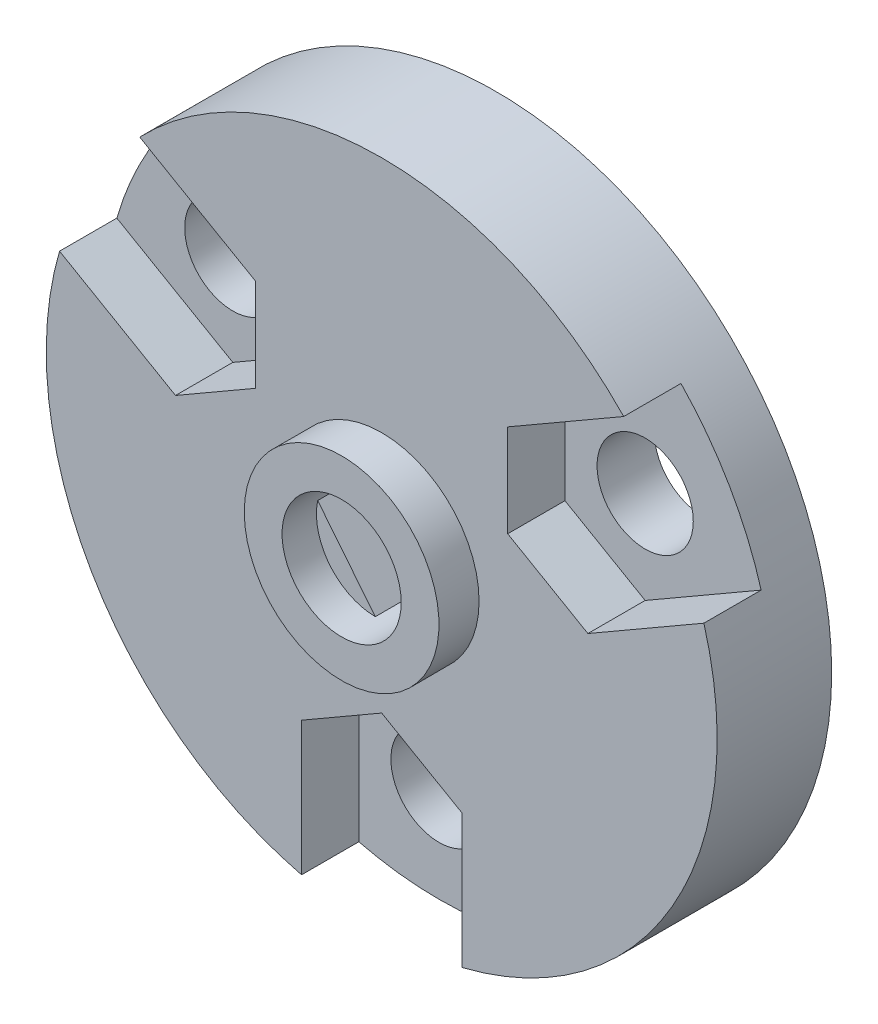
ISO-10303-21;
HEADER;
FILE_DESCRIPTION(('STEP AP214'),'2;1');
FILE_NAME('part.step','',(''),(''),'','','');
FILE_SCHEMA(('AUTOMOTIVE_DESIGN { 1 0 10303 214 1 1 1 1 }'));
ENDSEC;
DATA;
#1=APPLICATION_CONTEXT('core data for automotive mechanical design processes');
#2=APPLICATION_PROTOCOL_DEFINITION('international standard','automotive_design',2000,#1);
#3=PRODUCT_CONTEXT('',#1,'mechanical');
#4=PRODUCT('Part','Part','',(#3));
#5=PRODUCT_RELATED_PRODUCT_CATEGORY('part','',(#4));
#6=PRODUCT_DEFINITION_FORMATION('','',#4);
#7=PRODUCT_DEFINITION_CONTEXT('part definition',#1,'design');
#8=PRODUCT_DEFINITION('design','',#6,#7);
#9=PRODUCT_DEFINITION_SHAPE('','',#8);
#10=(LENGTH_UNIT() NAMED_UNIT(*) SI_UNIT(.MILLI.,.METRE.));
#11=(NAMED_UNIT(*) PLANE_ANGLE_UNIT() SI_UNIT($,.RADIAN.));
#12=(NAMED_UNIT(*) SI_UNIT($,.STERADIAN.) SOLID_ANGLE_UNIT());
#13=UNCERTAINTY_MEASURE_WITH_UNIT(LENGTH_MEASURE(1.E-05),#10,'distance_accuracy_value','');
#14=(GEOMETRIC_REPRESENTATION_CONTEXT(3) GLOBAL_UNCERTAINTY_ASSIGNED_CONTEXT((#13)) GLOBAL_UNIT_ASSIGNED_CONTEXT((#10,
#11,#12)) REPRESENTATION_CONTEXT('',''));
#15=CARTESIAN_POINT('',(0.,0.,0.));
#16=DIRECTION('',(0.,0.,1.));
#17=DIRECTION('',(1.,0.,0.));
#18=AXIS2_PLACEMENT_3D('',#15,#16,#17);
#19=CARTESIAN_POINT('',(0.,0.,5.24999999999999));
#20=DIRECTION('',(0.,0.,1.));
#21=DIRECTION('',(1.,0.,0.));
#22=AXIS2_PLACEMENT_3D('',#19,#20,#21);
#23=PLANE('',#22);
#24=DIRECTION('',(0.625469901980904,-0.780248294913868,0.));
#25=VECTOR('',#24,1.);
#26=CARTESIAN_POINT('',(-1.28740968660788,-1.03202533826849,5.24999999999999));
#27=LINE('',#26,#25);
#28=CARTESIAN_POINT('',(-2.54419959171201,0.535769015091784,5.24999999999999));
#29=VERTEX_POINT('',#28);
#30=CARTESIAN_POINT('',(-0.0306197815037451,-2.59981969162876,5.24999999999999));
#31=VERTEX_POINT('',#30);
#32=EDGE_CURVE('E12',#29,#31,#27,.T.);
#33=ORIENTED_EDGE('',*,*,#32,.F.);
#34=CARTESIAN_POINT('',(0.,0.,5.24999999999999));
#35=DIRECTION('',(0.,0.,1.));
#36=DIRECTION('',(1.,0.,0.));
#37=AXIS2_PLACEMENT_3D('',#34,#35,#36);
#38=CIRCLE('',#37,2.6);
#39=EDGE_CURVE('E198',#29,#31,#38,.T.);
#40=ORIENTED_EDGE('',*,*,#39,.T.);
#41=EDGE_LOOP('',(#33,#40));
#42=FACE_BOUND('',#41,.T.);
#43=ADVANCED_FACE('F38',(#42),#23,.T.);
#44=CARTESIAN_POINT('',(0.,0.,5.));
#45=DIRECTION('',(0.,0.,1.));
#46=DIRECTION('',(1.,0.,0.));
#47=AXIS2_PLACEMENT_3D('',#44,#45,#46);
#48=PLANE('',#47);
#49=DIRECTION('',(0.,1.,0.));
#50=VECTOR('',#49,1.);
#51=CARTESIAN_POINT('',(-3.5,-8.37157890324957,5.));
#52=LINE('',#51,#50);
#53=CARTESIAN_POINT('',(-3.5,-14.2178441117496,5.));
#54=VERTEX_POINT('',#53);
#55=CARTESIAN_POINT('',(-3.5,-8.37157890324957,5.));
#56=VERTEX_POINT('',#55);
#57=EDGE_CURVE('E226',#54,#56,#52,.T.);
#58=ORIENTED_EDGE('',*,*,#57,.T.);
#59=DIRECTION('',(0.866025403784439,0.499999999999999,0.));
#60=VECTOR('',#59,1.);
#61=CARTESIAN_POINT('',(0.,-6.35085296108588,5.));
#62=LINE('',#61,#60);
#63=CARTESIAN_POINT('',(0.,-6.35085296108588,5.));
#64=VERTEX_POINT('',#63);
#65=EDGE_CURVE('E229',#56,#64,#62,.T.);
#66=ORIENTED_EDGE('',*,*,#65,.T.);
#67=DIRECTION('',(0.866025403784438,-0.500000000000001,0.));
#68=VECTOR('',#67,1.);
#69=CARTESIAN_POINT('',(3.5,-8.37157890324958,5.));
#70=LINE('',#69,#68);
#71=CARTESIAN_POINT('',(3.5,-8.37157890324958,5.));
#72=VERTEX_POINT('',#71);
#73=EDGE_CURVE('E232',#64,#72,#70,.T.);
#74=ORIENTED_EDGE('',*,*,#73,.T.);
#75=DIRECTION('',(0.,-1.,0.));
#76=VECTOR('',#75,1.);
#77=CARTESIAN_POINT('',(3.5,-8.37157890324958,5.));
#78=LINE('',#77,#76);
#79=CARTESIAN_POINT('',(3.5,-14.2178441117496,5.));
#80=VERTEX_POINT('',#79);
#81=EDGE_CURVE('E234',#72,#80,#78,.T.);
#82=ORIENTED_EDGE('',*,*,#81,.T.);
#83=CARTESIAN_POINT('',(0.,0.,5.));
#84=DIRECTION('',(0.,0.,1.));
#85=DIRECTION('',(1.,0.,0.));
#86=AXIS2_PLACEMENT_3D('',#83,#84,#85);
#87=CIRCLE('',#86,14.6423048454133);
#88=CARTESIAN_POINT('',(14.0630141878222,4.07783314262928,5.));
#89=VERTEX_POINT('',#88);
#90=EDGE_CURVE('E236',#80,#89,#87,.T.);
#91=ORIENTED_EDGE('',*,*,#90,.T.);
#92=DIRECTION('',(-0.866025403784439,-0.5,0.));
#93=VECTOR('',#92,1.);
#94=CARTESIAN_POINT('',(8.99999999999999,1.15470053837925,5.));
#95=LINE('',#94,#93);
#96=CARTESIAN_POINT('',(8.99999999999999,1.15470053837925,5.));
#97=VERTEX_POINT('',#96);
#98=EDGE_CURVE('E238',#89,#97,#95,.T.);
#99=ORIENTED_EDGE('',*,*,#98,.T.);
#100=DIRECTION('',(-0.866025403784438,0.500000000000001,0.));
#101=VECTOR('',#100,1.);
#102=CARTESIAN_POINT('',(5.5,3.17542648054294,5.));
#103=LINE('',#102,#101);
#104=CARTESIAN_POINT('',(5.5,3.17542648054294,5.));
#105=VERTEX_POINT('',#104);
#106=EDGE_CURVE('E240',#97,#105,#103,.T.);
#107=ORIENTED_EDGE('',*,*,#106,.T.);
#108=DIRECTION('',(0.,1.,0.));
#109=VECTOR('',#108,1.);
#110=CARTESIAN_POINT('',(5.5,7.21687836487032,5.));
#111=LINE('',#110,#109);
#112=CARTESIAN_POINT('',(5.5,7.21687836487032,5.));
#113=VERTEX_POINT('',#112);
#114=EDGE_CURVE('E242',#105,#113,#111,.T.);
#115=ORIENTED_EDGE('',*,*,#114,.T.);
#116=DIRECTION('',(0.866025403784438,0.5,0.));
#117=VECTOR('',#116,1.);
#118=CARTESIAN_POINT('',(5.5,7.21687836487032,5.));
#119=LINE('',#118,#117);
#120=CARTESIAN_POINT('',(10.5630141878222,10.1400109691203,5.));
#121=VERTEX_POINT('',#120);
#122=EDGE_CURVE('E244',#113,#121,#119,.T.);
#123=ORIENTED_EDGE('',*,*,#122,.T.);
#124=CARTESIAN_POINT('',(0.,0.,5.));
#125=DIRECTION('',(0.,0.,1.));
#126=DIRECTION('',(1.,0.,0.));
#127=AXIS2_PLACEMENT_3D('',#124,#125,#126);
#128=CIRCLE('',#127,14.6423048454133);
#129=CARTESIAN_POINT('',(-10.5630141878222,10.1400109691203,5.));
#130=VERTEX_POINT('',#129);
#131=EDGE_CURVE('E246',#121,#130,#128,.T.);
#132=ORIENTED_EDGE('',*,*,#131,.T.);
#133=DIRECTION('',(0.866025403784439,-0.5,0.));
#134=VECTOR('',#133,1.);
#135=CARTESIAN_POINT('',(-5.5,7.21687836487031,5.));
#136=LINE('',#135,#134);
#137=CARTESIAN_POINT('',(-5.5,7.21687836487031,5.));
#138=VERTEX_POINT('',#137);
#139=EDGE_CURVE('E248',#130,#138,#136,.T.);
#140=ORIENTED_EDGE('',*,*,#139,.T.);
#141=DIRECTION('',(0.,-1.,0.));
#142=VECTOR('',#141,1.);
#143=CARTESIAN_POINT('',(-5.5,3.17542648054294,5.));
#144=LINE('',#143,#142);
#145=CARTESIAN_POINT('',(-5.5,3.17542648054294,5.));
#146=VERTEX_POINT('',#145);
#147=EDGE_CURVE('E250',#138,#146,#144,.T.);
#148=ORIENTED_EDGE('',*,*,#147,.T.);
#149=DIRECTION('',(-0.866025403784439,-0.499999999999999,0.));
#150=VECTOR('',#149,1.);
#151=CARTESIAN_POINT('',(-9.,1.15470053837925,5.));
#152=LINE('',#151,#150);
#153=CARTESIAN_POINT('',(-9.,1.15470053837925,5.));
#154=VERTEX_POINT('',#153);
#155=EDGE_CURVE('E252',#146,#154,#152,.T.);
#156=ORIENTED_EDGE('',*,*,#155,.T.);
#157=DIRECTION('',(-0.866025403784439,0.5,0.));
#158=VECTOR('',#157,1.);
#159=CARTESIAN_POINT('',(-9.,1.15470053837925,5.));
#160=LINE('',#159,#158);
#161=CARTESIAN_POINT('',(-14.0630141878222,4.07783314262927,5.));
#162=VERTEX_POINT('',#161);
#163=EDGE_CURVE('E254',#154,#162,#160,.T.);
#164=ORIENTED_EDGE('',*,*,#163,.T.);
#165=CARTESIAN_POINT('',(0.,0.,5.));
#166=DIRECTION('',(0.,0.,1.));
#167=DIRECTION('',(1.,0.,0.));
#168=AXIS2_PLACEMENT_3D('',#165,#166,#167);
#169=CIRCLE('',#168,14.6423048454133);
#170=EDGE_CURVE('E256',#162,#54,#169,.T.);
#171=ORIENTED_EDGE('',*,*,#170,.T.);
#172=EDGE_LOOP('',(#58,#66,#74,#82,#91,#99,#107,#115,#123,#132,#140,#148,#156,#164,#171));
#173=FACE_BOUND('',#172,.T.);
#174=CARTESIAN_POINT('',(0.,0.,5.));
#175=DIRECTION('',(0.,0.,1.));
#176=DIRECTION('',(1.,0.,0.));
#177=AXIS2_PLACEMENT_3D('',#174,#175,#176);
#178=CIRCLE('',#177,4.25);
#179=CARTESIAN_POINT('',(4.25,0.,5.));
#180=VERTEX_POINT('',#179);
#181=EDGE_CURVE('E201',#180,#180,#178,.T.);
#182=ORIENTED_EDGE('',*,*,#181,.F.);
#183=EDGE_LOOP('',(#182));
#184=FACE_BOUND('',#183,.T.);
#185=ADVANCED_FACE('F365',(#173,#184),#48,.T.);
#186=CARTESIAN_POINT('',(0.,0.,2.5));
#187=DIRECTION('',(0.,0.,1.));
#188=DIRECTION('',(1.,0.,0.));
#189=AXIS2_PLACEMENT_3D('',#186,#187,#188);
#190=PLANE('',#189);
#191=CARTESIAN_POINT('',(-9.00000000000001,5.19615242270664,2.5));
#192=DIRECTION('',(0.,0.,1.));
#193=DIRECTION('',(1.,0.,0.));
#194=AXIS2_PLACEMENT_3D('',#191,#192,#193);
#195=CIRCLE('',#194,2.1);
#196=CARTESIAN_POINT('',(-6.9,5.19615242270664,2.5));
#197=VERTEX_POINT('',#196);
#198=EDGE_CURVE('E219',#197,#197,#195,.T.);
#199=ORIENTED_EDGE('',*,*,#198,.F.);
#200=EDGE_LOOP('',(#199));
#201=FACE_BOUND('',#200,.T.);
#202=DIRECTION('',(-0.866025403784439,0.5,0.));
#203=VECTOR('',#202,1.);
#204=CARTESIAN_POINT('',(-9.,1.15470053837925,2.5));
#205=LINE('',#204,#203);
#206=CARTESIAN_POINT('',(-9.,1.15470053837925,2.5));
#207=VERTEX_POINT('',#206);
#208=CARTESIAN_POINT('',(-14.0630141878222,4.07783314262927,2.5));
#209=VERTEX_POINT('',#208);
#210=EDGE_CURVE('E230',#207,#209,#205,.T.);
#211=ORIENTED_EDGE('',*,*,#210,.F.);
#212=DIRECTION('',(-0.866025403784439,-0.499999999999999,0.));
#213=VECTOR('',#212,1.);
#214=CARTESIAN_POINT('',(-9.,1.15470053837925,2.5));
#215=LINE('',#214,#213);
#216=CARTESIAN_POINT('',(-5.5,3.17542648054294,2.5));
#217=VERTEX_POINT('',#216);
#218=EDGE_CURVE('E312',#217,#207,#215,.T.);
#219=ORIENTED_EDGE('',*,*,#218,.F.);
#220=DIRECTION('',(0.,-1.,0.));
#221=VECTOR('',#220,1.);
#222=CARTESIAN_POINT('',(-5.5,3.17542648054294,2.5));
#223=LINE('',#222,#221);
#224=CARTESIAN_POINT('',(-5.5,7.21687836487031,2.5));
#225=VERTEX_POINT('',#224);
#226=EDGE_CURVE('E495',#225,#217,#223,.T.);
#227=ORIENTED_EDGE('',*,*,#226,.F.);
#228=DIRECTION('',(0.866025403784439,-0.5,0.));
#229=VECTOR('',#228,1.);
#230=CARTESIAN_POINT('',(-5.5,7.21687836487031,2.5));
#231=LINE('',#230,#229);
#232=CARTESIAN_POINT('',(-10.5630141878222,10.1400109691203,2.5));
#233=VERTEX_POINT('',#232);
#234=EDGE_CURVE('E500',#233,#225,#231,.T.);
#235=ORIENTED_EDGE('',*,*,#234,.F.);
#236=CARTESIAN_POINT('',(0.,0.,2.5));
#237=DIRECTION('',(0.,0.,1.));
#238=DIRECTION('',(1.,0.,0.));
#239=AXIS2_PLACEMENT_3D('',#236,#237,#238);
#240=CIRCLE('',#239,14.6423048454133);
#241=EDGE_CURVE('E284',#233,#209,#240,.T.);
#242=ORIENTED_EDGE('',*,*,#241,.T.);
#243=EDGE_LOOP('',(#211,#219,#227,#235,#242));
#244=FACE_BOUND('',#243,.T.);
#245=ADVANCED_FACE('F362',(#201,#244),#190,.T.);
#246=CARTESIAN_POINT('',(8.99999999999999,5.19615242270664,2.5));
#247=DIRECTION('',(0.,0.,1.));
#248=DIRECTION('',(1.,0.,0.));
#249=AXIS2_PLACEMENT_3D('',#246,#247,#248);
#250=CIRCLE('',#249,2.1);
#251=CARTESIAN_POINT('',(11.1,5.19615242270664,2.5));
#252=VERTEX_POINT('',#251);
#253=EDGE_CURVE('E213',#252,#252,#250,.T.);
#254=ORIENTED_EDGE('',*,*,#253,.F.);
#255=EDGE_LOOP('',(#254));
#256=FACE_BOUND('',#255,.T.);
#257=DIRECTION('',(0.866025403784438,0.5,0.));
#258=VECTOR('',#257,1.);
#259=CARTESIAN_POINT('',(5.5,7.21687836487032,2.5));
#260=LINE('',#259,#258);
#261=CARTESIAN_POINT('',(5.5,7.21687836487032,2.5));
#262=VERTEX_POINT('',#261);
#263=CARTESIAN_POINT('',(10.5630141878222,10.1400109691203,2.5));
#264=VERTEX_POINT('',#263);
#265=EDGE_CURVE('E481',#262,#264,#260,.T.);
#266=ORIENTED_EDGE('',*,*,#265,.F.);
#267=DIRECTION('',(0.,1.,0.));
#268=VECTOR('',#267,1.);
#269=CARTESIAN_POINT('',(5.5,7.21687836487032,2.5));
#270=LINE('',#269,#268);
#271=CARTESIAN_POINT('',(5.5,3.17542648054294,2.5));
#272=VERTEX_POINT('',#271);
#273=EDGE_CURVE('E502',#272,#262,#270,.T.);
#274=ORIENTED_EDGE('',*,*,#273,.F.);
#275=DIRECTION('',(-0.866025403784438,0.500000000000001,0.));
#276=VECTOR('',#275,1.);
#277=CARTESIAN_POINT('',(5.5,3.17542648054294,2.5));
#278=LINE('',#277,#276);
#279=CARTESIAN_POINT('',(8.99999999999999,1.15470053837925,2.5));
#280=VERTEX_POINT('',#279);
#281=EDGE_CURVE('E268',#280,#272,#278,.T.);
#282=ORIENTED_EDGE('',*,*,#281,.F.);
#283=DIRECTION('',(-0.866025403784439,-0.5,0.));
#284=VECTOR('',#283,1.);
#285=CARTESIAN_POINT('',(8.99999999999999,1.15470053837925,2.5));
#286=LINE('',#285,#284);
#287=CARTESIAN_POINT('',(14.0630141878222,4.07783314262927,2.5));
#288=VERTEX_POINT('',#287);
#289=EDGE_CURVE('E274',#288,#280,#286,.T.);
#290=ORIENTED_EDGE('',*,*,#289,.F.);
#291=EDGE_CURVE('E283',#288,#264,#240,.T.);
#292=ORIENTED_EDGE('',*,*,#291,.T.);
#293=EDGE_LOOP('',(#266,#274,#282,#290,#292));
#294=FACE_BOUND('',#293,.T.);
#295=ADVANCED_FACE('F363',(#256,#294),#190,.T.);
#296=CARTESIAN_POINT('',(0.,0.,2.5));
#297=DIRECTION('',(0.,0.,-1.));
#298=DIRECTION('',(-1.,0.,0.));
#299=AXIS2_PLACEMENT_3D('',#296,#297,#298);
#300=CYLINDRICAL_SURFACE('',#299,14.6423048454133);
#301=ORIENTED_EDGE('',*,*,#291,.F.);
#302=DIRECTION('',(0.,0.,-1.));
#303=VECTOR('',#302,1.);
#304=CARTESIAN_POINT('',(14.0630141878222,4.07783314262928,5.));
#305=LINE('',#304,#303);
#306=EDGE_CURVE('E281',#89,#288,#305,.T.);
#307=ORIENTED_EDGE('',*,*,#306,.F.);
#308=ORIENTED_EDGE('',*,*,#90,.F.);
#309=DIRECTION('',(0.,0.,-1.));
#310=VECTOR('',#309,1.);
#311=CARTESIAN_POINT('',(3.5,-14.2178441117496,5.));
#312=LINE('',#311,#310);
#313=CARTESIAN_POINT('',(3.50000000000001,-14.2178441117496,2.5));
#314=VERTEX_POINT('',#313);
#315=EDGE_CURVE('E277',#80,#314,#312,.T.);
#316=ORIENTED_EDGE('',*,*,#315,.T.);
#317=CARTESIAN_POINT('',(-3.49999999999999,-14.2178441117496,2.5));
#318=VERTEX_POINT('',#317);
#319=EDGE_CURVE('E289',#318,#314,#240,.T.);
#320=ORIENTED_EDGE('',*,*,#319,.F.);
#321=DIRECTION('',(0.,0.,-1.));
#322=VECTOR('',#321,1.);
#323=CARTESIAN_POINT('',(-3.5,-14.2178441117496,5.));
#324=LINE('',#323,#322);
#325=EDGE_CURVE('E258',#54,#318,#324,.T.);
#326=ORIENTED_EDGE('',*,*,#325,.F.);
#327=ORIENTED_EDGE('',*,*,#170,.F.);
#328=DIRECTION('',(0.,0.,-1.));
#329=VECTOR('',#328,1.);
#330=CARTESIAN_POINT('',(-14.0630141878222,4.07783314262927,5.));
#331=LINE('',#330,#329);
#332=EDGE_CURVE('E306',#162,#209,#331,.T.);
#333=ORIENTED_EDGE('',*,*,#332,.T.);
#334=ORIENTED_EDGE('',*,*,#241,.F.);
#335=DIRECTION('',(0.,0.,-1.));
#336=VECTOR('',#335,1.);
#337=CARTESIAN_POINT('',(-10.5630141878222,10.1400109691203,5.));
#338=LINE('',#337,#336);
#339=EDGE_CURVE('E327',#130,#233,#338,.T.);
#340=ORIENTED_EDGE('',*,*,#339,.F.);
#341=ORIENTED_EDGE('',*,*,#131,.F.);
#342=DIRECTION('',(0.,0.,-1.));
#343=VECTOR('',#342,1.);
#344=CARTESIAN_POINT('',(10.5630141878222,10.1400109691203,5.));
#345=LINE('',#344,#343);
#346=EDGE_CURVE('E332',#121,#264,#345,.T.);
#347=ORIENTED_EDGE('',*,*,#346,.T.);
#348=EDGE_LOOP('',(#301,#307,#308,#316,#320,#326,#327,#333,#334,#340,#341,#347));
#349=FACE_BOUND('',#348,.T.);
#350=CARTESIAN_POINT('',(0.,0.,0.));
#351=DIRECTION('',(0.,0.,1.));
#352=DIRECTION('',(1.,0.,0.));
#353=AXIS2_PLACEMENT_3D('',#350,#351,#352);
#354=CIRCLE('',#353,14.6423048454133);
#355=CARTESIAN_POINT('',(14.6423048454133,0.,0.));
#356=VERTEX_POINT('',#355);
#357=EDGE_CURVE('E293',#356,#356,#354,.T.);
#358=ORIENTED_EDGE('',*,*,#357,.T.);
#359=EDGE_LOOP('',(#358));
#360=FACE_BOUND('',#359,.T.);
#361=ADVANCED_FACE('F40',(#349,#360),#300,.T.);
#362=CARTESIAN_POINT('',(0.,-10.3923048454133,2.5));
#363=DIRECTION('',(0.,0.,1.));
#364=DIRECTION('',(1.,0.,0.));
#365=AXIS2_PLACEMENT_3D('',#362,#363,#364);
#366=CIRCLE('',#365,2.1);
#367=CARTESIAN_POINT('',(2.1,-10.3923048454133,2.5));
#368=VERTEX_POINT('',#367);
#369=EDGE_CURVE('E207',#368,#368,#366,.T.);
#370=ORIENTED_EDGE('',*,*,#369,.F.);
#371=EDGE_LOOP('',(#370));
#372=FACE_BOUND('',#371,.T.);
#373=DIRECTION('',(0.,1.,0.));
#374=VECTOR('',#373,1.);
#375=CARTESIAN_POINT('',(-3.5,-8.37157890324957,2.5));
#376=LINE('',#375,#374);
#377=CARTESIAN_POINT('',(-3.5,-8.37157890324957,2.5));
#378=VERTEX_POINT('',#377);
#379=EDGE_CURVE('E225',#318,#378,#376,.T.);
#380=ORIENTED_EDGE('',*,*,#379,.F.);
#381=ORIENTED_EDGE('',*,*,#319,.T.);
#382=DIRECTION('',(0.,-1.,0.));
#383=VECTOR('',#382,1.);
#384=CARTESIAN_POINT('',(3.5,-8.37157890324958,2.5));
#385=LINE('',#384,#383);
#386=CARTESIAN_POINT('',(3.5,-8.37157890324958,2.5));
#387=VERTEX_POINT('',#386);
#388=EDGE_CURVE('E265',#387,#314,#385,.T.);
#389=ORIENTED_EDGE('',*,*,#388,.F.);
#390=DIRECTION('',(0.866025403784438,-0.500000000000001,0.));
#391=VECTOR('',#390,1.);
#392=CARTESIAN_POINT('',(3.5,-8.37157890324958,2.5));
#393=LINE('',#392,#391);
#394=CARTESIAN_POINT('',(0.,-6.35085296108588,2.5));
#395=VERTEX_POINT('',#394);
#396=EDGE_CURVE('E262',#395,#387,#393,.T.);
#397=ORIENTED_EDGE('',*,*,#396,.F.);
#398=DIRECTION('',(0.866025403784439,0.499999999999999,0.));
#399=VECTOR('',#398,1.);
#400=CARTESIAN_POINT('',(0.,-6.35085296108588,2.5));
#401=LINE('',#400,#399);
#402=EDGE_CURVE('E259',#378,#395,#401,.T.);
#403=ORIENTED_EDGE('',*,*,#402,.F.);
#404=EDGE_LOOP('',(#380,#381,#389,#397,#403));
#405=FACE_BOUND('',#404,.T.);
#406=ADVANCED_FACE('F352',(#372,#405),#190,.T.);
#407=CARTESIAN_POINT('',(0.,0.,0.));
#408=DIRECTION('',(0.,0.,1.));
#409=DIRECTION('',(1.,0.,0.));
#410=AXIS2_PLACEMENT_3D('',#407,#408,#409);
#411=PLANE('',#410);
#412=DIRECTION('',(0.625469901980903,-0.780248294913868,0.));
#413=VECTOR('',#412,1.);
#414=CARTESIAN_POINT('',(-0.0306197815037451,-2.59981969162876,0.));
#415=LINE('',#414,#413);
#416=CARTESIAN_POINT('',(-2.54419959171201,0.535769015091784,0.));
#417=VERTEX_POINT('',#416);
#418=CARTESIAN_POINT('',(-0.0306197815037451,-2.59981969162876,0.));
#419=VERTEX_POINT('',#418);
#420=EDGE_CURVE('E177',#417,#419,#415,.T.);
#421=ORIENTED_EDGE('',*,*,#420,.T.);
#422=CARTESIAN_POINT('',(0.,0.,0.));
#423=DIRECTION('',(0.,0.,1.));
#424=DIRECTION('',(1.,0.,0.));
#425=AXIS2_PLACEMENT_3D('',#422,#423,#424);
#426=CIRCLE('',#425,2.6);
#427=CARTESIAN_POINT('',(2.54419959171202,-0.535769015091775,0.));
#428=VERTEX_POINT('',#427);
#429=EDGE_CURVE('E172',#419,#428,#426,.T.);
#430=ORIENTED_EDGE('',*,*,#429,.T.);
#431=DIRECTION('',(-0.625469901980903,0.780248294913869,0.));
#432=VECTOR('',#431,1.);
#433=CARTESIAN_POINT('',(2.54419959171202,-0.535769015091775,0.));
#434=LINE('',#433,#432);
#435=CARTESIAN_POINT('',(0.0306197815037564,2.59981969162876,0.));
#436=VERTEX_POINT('',#435);
#437=EDGE_CURVE('E180',#428,#436,#434,.T.);
#438=ORIENTED_EDGE('',*,*,#437,.T.);
#439=CARTESIAN_POINT('',(0.,0.,0.));
#440=DIRECTION('',(0.,0.,1.));
#441=DIRECTION('',(1.,0.,0.));
#442=AXIS2_PLACEMENT_3D('',#439,#440,#441);
#443=CIRCLE('',#442,2.6);
#444=EDGE_CURVE('E53',#436,#417,#443,.T.);
#445=ORIENTED_EDGE('',*,*,#444,.T.);
#446=EDGE_LOOP('',(#421,#430,#438,#445));
#447=FACE_BOUND('',#446,.T.);
#448=CARTESIAN_POINT('',(0.,-10.3923048454133,0.));
#449=DIRECTION('',(0.,0.,1.));
#450=DIRECTION('',(1.,0.,0.));
#451=AXIS2_PLACEMENT_3D('',#448,#449,#450);
#452=CIRCLE('',#451,2.1);
#453=CARTESIAN_POINT('',(2.1,-10.3923048454133,0.));
#454=VERTEX_POINT('',#453);
#455=EDGE_CURVE('E210',#454,#454,#452,.F.);
#456=ORIENTED_EDGE('',*,*,#455,.F.);
#457=EDGE_LOOP('',(#456));
#458=FACE_BOUND('',#457,.T.);
#459=CARTESIAN_POINT('',(8.99999999999999,5.19615242270664,0.));
#460=DIRECTION('',(0.,0.,1.));
#461=DIRECTION('',(1.,0.,0.));
#462=AXIS2_PLACEMENT_3D('',#459,#460,#461);
#463=CIRCLE('',#462,2.1);
#464=CARTESIAN_POINT('',(11.1,5.19615242270664,0.));
#465=VERTEX_POINT('',#464);
#466=EDGE_CURVE('E216',#465,#465,#463,.F.);
#467=ORIENTED_EDGE('',*,*,#466,.F.);
#468=EDGE_LOOP('',(#467));
#469=FACE_BOUND('',#468,.T.);
#470=CARTESIAN_POINT('',(-9.00000000000001,5.19615242270664,0.));
#471=DIRECTION('',(0.,0.,1.));
#472=DIRECTION('',(1.,0.,0.));
#473=AXIS2_PLACEMENT_3D('',#470,#471,#472);
#474=CIRCLE('',#473,2.1);
#475=CARTESIAN_POINT('',(-6.9,5.19615242270664,0.));
#476=VERTEX_POINT('',#475);
#477=EDGE_CURVE('E222',#476,#476,#474,.F.);
#478=ORIENTED_EDGE('',*,*,#477,.F.);
#479=EDGE_LOOP('',(#478));
#480=FACE_BOUND('',#479,.T.);
#481=ORIENTED_EDGE('',*,*,#357,.F.);
#482=EDGE_LOOP('',(#481));
#483=FACE_BOUND('',#482,.T.);
#484=ADVANCED_FACE('F184',(#447,#458,#469,#480,#483),#411,.F.);
#485=CARTESIAN_POINT('',(-3.5,-8.37157890324957,5.));
#486=DIRECTION('',(-1.,0.,0.));
#487=DIRECTION('',(0.,-1.,0.));
#488=AXIS2_PLACEMENT_3D('',#485,#486,#487);
#489=PLANE('',#488);
#490=ORIENTED_EDGE('',*,*,#379,.T.);
#491=DIRECTION('',(0.,0.,-1.));
#492=VECTOR('',#491,1.);
#493=CARTESIAN_POINT('',(-3.5,-8.37157890324957,5.));
#494=LINE('',#493,#492);
#495=EDGE_CURVE('E342',#56,#378,#494,.T.);
#496=ORIENTED_EDGE('',*,*,#495,.F.);
#497=ORIENTED_EDGE('',*,*,#57,.F.);
#498=ORIENTED_EDGE('',*,*,#325,.T.);
#499=EDGE_LOOP('',(#490,#496,#497,#498));
#500=FACE_BOUND('',#499,.T.);
#501=ADVANCED_FACE('F351',(#500),#489,.F.);
#502=CARTESIAN_POINT('',(0.,-6.35085296108588,5.));
#503=DIRECTION('',(-0.499999999999999,0.866025403784439,0.));
#504=DIRECTION('',(-0.866025403784439,-0.499999999999999,0.));
#505=AXIS2_PLACEMENT_3D('',#502,#503,#504);
#506=PLANE('',#505);
#507=ORIENTED_EDGE('',*,*,#402,.T.);
#508=DIRECTION('',(0.,0.,-1.));
#509=VECTOR('',#508,1.);
#510=CARTESIAN_POINT('',(0.,-6.35085296108588,5.));
#511=LINE('',#510,#509);
#512=EDGE_CURVE('E340',#64,#395,#511,.T.);
#513=ORIENTED_EDGE('',*,*,#512,.F.);
#514=ORIENTED_EDGE('',*,*,#65,.F.);
#515=ORIENTED_EDGE('',*,*,#495,.T.);
#516=EDGE_LOOP('',(#507,#513,#514,#515));
#517=FACE_BOUND('',#516,.T.);
#518=ADVANCED_FACE('F357',(#517),#506,.F.);
#519=CARTESIAN_POINT('',(3.5,-8.37157890324958,5.));
#520=DIRECTION('',(0.500000000000001,0.866025403784438,0.));
#521=DIRECTION('',(-0.866025403784438,0.500000000000001,0.));
#522=AXIS2_PLACEMENT_3D('',#519,#520,#521);
#523=PLANE('',#522);
#524=ORIENTED_EDGE('',*,*,#396,.T.);
#525=DIRECTION('',(0.,0.,-1.));
#526=VECTOR('',#525,1.);
#527=CARTESIAN_POINT('',(3.5,-8.37157890324958,5.));
#528=LINE('',#527,#526);
#529=EDGE_CURVE('E280',#72,#387,#528,.T.);
#530=ORIENTED_EDGE('',*,*,#529,.F.);
#531=ORIENTED_EDGE('',*,*,#73,.F.);
#532=ORIENTED_EDGE('',*,*,#512,.T.);
#533=EDGE_LOOP('',(#524,#530,#531,#532));
#534=FACE_BOUND('',#533,.T.);
#535=ADVANCED_FACE('F444',(#534),#523,.F.);
#536=CARTESIAN_POINT('',(3.5,-8.37157890324958,5.));
#537=DIRECTION('',(1.,0.,0.));
#538=DIRECTION('',(0.,1.,0.));
#539=AXIS2_PLACEMENT_3D('',#536,#537,#538);
#540=PLANE('',#539);
#541=ORIENTED_EDGE('',*,*,#388,.T.);
#542=ORIENTED_EDGE('',*,*,#315,.F.);
#543=ORIENTED_EDGE('',*,*,#81,.F.);
#544=ORIENTED_EDGE('',*,*,#529,.T.);
#545=EDGE_LOOP('',(#541,#542,#543,#544));
#546=FACE_BOUND('',#545,.T.);
#547=ADVANCED_FACE('F440',(#546),#540,.F.);
#548=CARTESIAN_POINT('',(8.99999999999999,1.15470053837925,5.));
#549=DIRECTION('',(0.5,-0.866025403784439,0.));
#550=DIRECTION('',(0.866025403784439,0.5,0.));
#551=AXIS2_PLACEMENT_3D('',#548,#549,#550);
#552=PLANE('',#551);
#553=ORIENTED_EDGE('',*,*,#289,.T.);
#554=DIRECTION('',(0.,0.,-1.));
#555=VECTOR('',#554,1.);
#556=CARTESIAN_POINT('',(8.99999999999999,1.15470053837925,5.));
#557=LINE('',#556,#555);
#558=EDGE_CURVE('E335',#97,#280,#557,.T.);
#559=ORIENTED_EDGE('',*,*,#558,.F.);
#560=ORIENTED_EDGE('',*,*,#98,.F.);
#561=ORIENTED_EDGE('',*,*,#306,.T.);
#562=EDGE_LOOP('',(#553,#559,#560,#561));
#563=FACE_BOUND('',#562,.T.);
#564=ADVANCED_FACE('F436',(#563),#552,.F.);
#565=CARTESIAN_POINT('',(5.5,3.17542648054294,5.));
#566=DIRECTION('',(-0.500000000000001,-0.866025403784438,0.));
#567=DIRECTION('',(0.866025403784438,-0.500000000000001,0.));
#568=AXIS2_PLACEMENT_3D('',#565,#566,#567);
#569=PLANE('',#568);
#570=ORIENTED_EDGE('',*,*,#281,.T.);
#571=DIRECTION('',(0.,0.,-1.));
#572=VECTOR('',#571,1.);
#573=CARTESIAN_POINT('',(5.5,3.17542648054294,5.));
#574=LINE('',#573,#572);
#575=EDGE_CURVE('E331',#105,#272,#574,.T.);
#576=ORIENTED_EDGE('',*,*,#575,.F.);
#577=ORIENTED_EDGE('',*,*,#106,.F.);
#578=ORIENTED_EDGE('',*,*,#558,.T.);
#579=EDGE_LOOP('',(#570,#576,#577,#578));
#580=FACE_BOUND('',#579,.T.);
#581=ADVANCED_FACE('F432',(#580),#569,.F.);
#582=CARTESIAN_POINT('',(5.5,7.21687836487032,5.));
#583=DIRECTION('',(-1.,0.,0.));
#584=DIRECTION('',(0.,-1.,0.));
#585=AXIS2_PLACEMENT_3D('',#582,#583,#584);
#586=PLANE('',#585);
#587=ORIENTED_EDGE('',*,*,#273,.T.);
#588=DIRECTION('',(0.,0.,-1.));
#589=VECTOR('',#588,1.);
#590=CARTESIAN_POINT('',(5.5,7.21687836487032,5.));
#591=LINE('',#590,#589);
#592=EDGE_CURVE('E328',#113,#262,#591,.T.);
#593=ORIENTED_EDGE('',*,*,#592,.F.);
#594=ORIENTED_EDGE('',*,*,#114,.F.);
#595=ORIENTED_EDGE('',*,*,#575,.T.);
#596=EDGE_LOOP('',(#587,#593,#594,#595));
#597=FACE_BOUND('',#596,.T.);
#598=ADVANCED_FACE('F428',(#597),#586,.F.);
#599=CARTESIAN_POINT('',(5.5,7.21687836487032,5.));
#600=DIRECTION('',(-0.5,0.866025403784438,0.));
#601=DIRECTION('',(-0.866025403784439,-0.5,0.));
#602=AXIS2_PLACEMENT_3D('',#599,#600,#601);
#603=PLANE('',#602);
#604=ORIENTED_EDGE('',*,*,#265,.T.);
#605=ORIENTED_EDGE('',*,*,#346,.F.);
#606=ORIENTED_EDGE('',*,*,#122,.F.);
#607=ORIENTED_EDGE('',*,*,#592,.T.);
#608=EDGE_LOOP('',(#604,#605,#606,#607));
#609=FACE_BOUND('',#608,.T.);
#610=ADVANCED_FACE('F424',(#609),#603,.F.);
#611=CARTESIAN_POINT('',(-5.5,7.21687836487031,5.));
#612=DIRECTION('',(0.5,0.866025403784439,0.));
#613=DIRECTION('',(-0.866025403784439,0.5,0.));
#614=AXIS2_PLACEMENT_3D('',#611,#612,#613);
#615=PLANE('',#614);
#616=ORIENTED_EDGE('',*,*,#234,.T.);
#617=DIRECTION('',(0.,0.,-1.));
#618=VECTOR('',#617,1.);
#619=CARTESIAN_POINT('',(-5.5,7.21687836487031,5.));
#620=LINE('',#619,#618);
#621=EDGE_CURVE('E324',#138,#225,#620,.T.);
#622=ORIENTED_EDGE('',*,*,#621,.F.);
#623=ORIENTED_EDGE('',*,*,#139,.F.);
#624=ORIENTED_EDGE('',*,*,#339,.T.);
#625=EDGE_LOOP('',(#616,#622,#623,#624));
#626=FACE_BOUND('',#625,.T.);
#627=ADVANCED_FACE('F420',(#626),#615,.F.);
#628=CARTESIAN_POINT('',(-5.5,3.17542648054294,5.));
#629=DIRECTION('',(1.,0.,0.));
#630=DIRECTION('',(0.,1.,0.));
#631=AXIS2_PLACEMENT_3D('',#628,#629,#630);
#632=PLANE('',#631);
#633=ORIENTED_EDGE('',*,*,#226,.T.);
#634=DIRECTION('',(0.,0.,-1.));
#635=VECTOR('',#634,1.);
#636=CARTESIAN_POINT('',(-5.5,3.17542648054294,5.));
#637=LINE('',#636,#635);
#638=EDGE_CURVE('E321',#146,#217,#637,.T.);
#639=ORIENTED_EDGE('',*,*,#638,.F.);
#640=ORIENTED_EDGE('',*,*,#147,.F.);
#641=ORIENTED_EDGE('',*,*,#621,.T.);
#642=EDGE_LOOP('',(#633,#639,#640,#641));
#643=FACE_BOUND('',#642,.T.);
#644=ADVANCED_FACE('F416',(#643),#632,.F.);
#645=CARTESIAN_POINT('',(-9.,1.15470053837925,5.));
#646=DIRECTION('',(0.499999999999999,-0.866025403784439,0.));
#647=DIRECTION('',(0.866025403784439,0.499999999999999,0.));
#648=AXIS2_PLACEMENT_3D('',#645,#646,#647);
#649=PLANE('',#648);
#650=ORIENTED_EDGE('',*,*,#218,.T.);
#651=DIRECTION('',(0.,0.,-1.));
#652=VECTOR('',#651,1.);
#653=CARTESIAN_POINT('',(-9.,1.15470053837925,5.));
#654=LINE('',#653,#652);
#655=EDGE_CURVE('E318',#154,#207,#654,.T.);
#656=ORIENTED_EDGE('',*,*,#655,.F.);
#657=ORIENTED_EDGE('',*,*,#155,.F.);
#658=ORIENTED_EDGE('',*,*,#638,.T.);
#659=EDGE_LOOP('',(#650,#656,#657,#658));
#660=FACE_BOUND('',#659,.T.);
#661=ADVANCED_FACE('F412',(#660),#649,.F.);
#662=CARTESIAN_POINT('',(-9.,1.15470053837925,5.));
#663=DIRECTION('',(-0.5,-0.866025403784439,0.));
#664=DIRECTION('',(0.866025403784439,-0.5,0.));
#665=AXIS2_PLACEMENT_3D('',#662,#663,#664);
#666=PLANE('',#665);
#667=ORIENTED_EDGE('',*,*,#210,.T.);
#668=ORIENTED_EDGE('',*,*,#332,.F.);
#669=ORIENTED_EDGE('',*,*,#163,.F.);
#670=ORIENTED_EDGE('',*,*,#655,.T.);
#671=EDGE_LOOP('',(#667,#668,#669,#670));
#672=FACE_BOUND('',#671,.T.);
#673=ADVANCED_FACE('F407',(#672),#666,.F.);
#674=CARTESIAN_POINT('',(-9.00000000000001,5.19615242270664,-0.00100000000000013));
#675=DIRECTION('',(0.,0.,1.));
#676=DIRECTION('',(1.,0.,0.));
#677=AXIS2_PLACEMENT_3D('',#674,#675,#676);
#678=CYLINDRICAL_SURFACE('',#677,2.1);
#679=ORIENTED_EDGE('',*,*,#198,.T.);
#680=EDGE_LOOP('',(#679));
#681=FACE_BOUND('',#680,.T.);
#682=ORIENTED_EDGE('',*,*,#477,.T.);
#683=EDGE_LOOP('',(#682));
#684=FACE_BOUND('',#683,.T.);
#685=ADVANCED_FACE('F404',(#681,#684),#678,.F.);
#686=CARTESIAN_POINT('',(8.99999999999999,5.19615242270664,-0.00100000000000013));
#687=DIRECTION('',(0.,0.,1.));
#688=DIRECTION('',(1.,0.,0.));
#689=AXIS2_PLACEMENT_3D('',#686,#687,#688);
#690=CYLINDRICAL_SURFACE('',#689,2.1);
#691=ORIENTED_EDGE('',*,*,#253,.T.);
#692=EDGE_LOOP('',(#691));
#693=FACE_BOUND('',#692,.T.);
#694=ORIENTED_EDGE('',*,*,#466,.T.);
#695=EDGE_LOOP('',(#694));
#696=FACE_BOUND('',#695,.T.);
#697=ADVANCED_FACE('F400',(#693,#696),#690,.F.);
#698=CARTESIAN_POINT('',(0.,-10.3923048454133,-0.00100000000000013));
#699=DIRECTION('',(0.,0.,1.));
#700=DIRECTION('',(1.,0.,0.));
#701=AXIS2_PLACEMENT_3D('',#698,#699,#700);
#702=CYLINDRICAL_SURFACE('',#701,2.1);
#703=ORIENTED_EDGE('',*,*,#369,.T.);
#704=EDGE_LOOP('',(#703));
#705=FACE_BOUND('',#704,.T.);
#706=ORIENTED_EDGE('',*,*,#455,.T.);
#707=EDGE_LOOP('',(#706));
#708=FACE_BOUND('',#707,.T.);
#709=ADVANCED_FACE('F396',(#705,#708),#702,.F.);
#710=CARTESIAN_POINT('',(0.,0.,19.2708152801713));
#711=DIRECTION('',(0.,0.,-1.));
#712=DIRECTION('',(-1.,0.,0.));
#713=AXIS2_PLACEMENT_3D('',#710,#711,#712);
#714=CYLINDRICAL_SURFACE('',#713,4.25);
#715=CARTESIAN_POINT('',(0.,0.,6.74999999999999));
#716=DIRECTION('',(0.,0.,-1.));
#717=DIRECTION('',(-1.,0.,0.));
#718=AXIS2_PLACEMENT_3D('',#715,#716,#717);
#719=CIRCLE('',#718,4.25);
#720=CARTESIAN_POINT('',(-4.25,0.,6.74999999999999));
#721=VERTEX_POINT('',#720);
#722=EDGE_CURVE('E204',#721,#721,#719,.T.);
#723=ORIENTED_EDGE('',*,*,#722,.T.);
#724=EDGE_LOOP('',(#723));
#725=FACE_BOUND('',#724,.T.);
#726=ORIENTED_EDGE('',*,*,#181,.T.);
#727=EDGE_LOOP('',(#726));
#728=FACE_BOUND('',#727,.T.);
#729=ADVANCED_FACE('F390',(#725,#728),#714,.T.);
#730=CARTESIAN_POINT('',(0.,0.,6.74999999999999));
#731=DIRECTION('',(0.,0.,-1.));
#732=DIRECTION('',(-1.,0.,0.));
#733=AXIS2_PLACEMENT_3D('',#730,#731,#732);
#734=PLANE('',#733);
#735=CARTESIAN_POINT('',(0.,0.,6.74999999999999));
#736=DIRECTION('',(0.,0.,1.));
#737=DIRECTION('',(1.,0.,0.));
#738=AXIS2_PLACEMENT_3D('',#735,#736,#737);
#739=CIRCLE('',#738,2.6);
#740=CARTESIAN_POINT('',(2.6,0.,6.74999999999999));
#741=VERTEX_POINT('',#740);
#742=EDGE_CURVE('E193',#741,#741,#739,.T.);
#743=ORIENTED_EDGE('',*,*,#742,.F.);
#744=EDGE_LOOP('',(#743));
#745=FACE_BOUND('',#744,.T.);
#746=ORIENTED_EDGE('',*,*,#722,.F.);
#747=EDGE_LOOP('',(#746));
#748=FACE_BOUND('',#747,.T.);
#749=ADVANCED_FACE('F386',(#745,#748),#734,.F.);
#750=CARTESIAN_POINT('',(0.,0.,5.24999999999999));
#751=DIRECTION('',(0.,0.,1.));
#752=DIRECTION('',(1.,0.,0.));
#753=AXIS2_PLACEMENT_3D('',#750,#751,#752);
#754=CYLINDRICAL_SURFACE('',#753,2.6);
#755=DIRECTION('',(0.,0.,1.));
#756=VECTOR('',#755,1.);
#757=CARTESIAN_POINT('',(-0.0306197815037451,-2.59981969162876,0.));
#758=LINE('',#757,#756);
#759=EDGE_CURVE('E191',#419,#31,#758,.T.);
#760=ORIENTED_EDGE('',*,*,#759,.T.);
#761=ORIENTED_EDGE('',*,*,#39,.F.);
#762=DIRECTION('',(0.,0.,1.));
#763=VECTOR('',#762,1.);
#764=CARTESIAN_POINT('',(-2.54419959171201,0.535769015091784,0.));
#765=LINE('',#764,#763);
#766=EDGE_CURVE('E194',#417,#29,#765,.T.);
#767=ORIENTED_EDGE('',*,*,#766,.F.);
#768=ORIENTED_EDGE('',*,*,#444,.F.);
#769=DIRECTION('',(0.,0.,1.));
#770=VECTOR('',#769,1.);
#771=CARTESIAN_POINT('',(0.0306197815037564,2.59981969162876,0.));
#772=LINE('',#771,#770);
#773=CARTESIAN_POINT('',(0.0306197815037564,2.59981969162876,5.24999999999999));
#774=VERTEX_POINT('',#773);
#775=EDGE_CURVE('E176',#436,#774,#772,.T.);
#776=ORIENTED_EDGE('',*,*,#775,.T.);
#777=CARTESIAN_POINT('',(2.54419959171202,-0.535769015091776,5.24999999999999));
#778=VERTEX_POINT('',#777);
#779=EDGE_CURVE('E175',#778,#774,#38,.T.);
#780=ORIENTED_EDGE('',*,*,#779,.F.);
#781=DIRECTION('',(0.,0.,1.));
#782=VECTOR('',#781,1.);
#783=CARTESIAN_POINT('',(2.54419959171202,-0.535769015091775,0.));
#784=LINE('',#783,#782);
#785=EDGE_CURVE('E61',#428,#778,#784,.T.);
#786=ORIENTED_EDGE('',*,*,#785,.F.);
#787=ORIENTED_EDGE('',*,*,#429,.F.);
#788=EDGE_LOOP('',(#760,#761,#767,#768,#776,#780,#786,#787));
#789=FACE_BOUND('',#788,.T.);
#790=ORIENTED_EDGE('',*,*,#742,.T.);
#791=EDGE_LOOP('',(#790));
#792=FACE_BOUND('',#791,.T.);
#793=ADVANCED_FACE('F169',(#789,#792),#754,.F.);
#794=DIRECTION('',(-0.625469901980903,0.780248294913869,0.));
#795=VECTOR('',#794,1.);
#796=CARTESIAN_POINT('',(1.28740968660789,1.03202533826849,5.24999999999999));
#797=LINE('',#796,#795);
#798=EDGE_CURVE('E46',#778,#774,#797,.T.);
#799=ORIENTED_EDGE('',*,*,#798,.F.);
#800=ORIENTED_EDGE('',*,*,#779,.T.);
#801=EDGE_LOOP('',(#799,#800));
#802=FACE_BOUND('',#801,.T.);
#803=ADVANCED_FACE('F368',(#802),#23,.T.);
#804=CARTESIAN_POINT('',(-0.0306197815037451,-2.59981969162876,0.));
#805=DIRECTION('',(-0.780248294913868,-0.625469901980904,0.));
#806=DIRECTION('',(0.625469901980904,-0.780248294913868,0.));
#807=AXIS2_PLACEMENT_3D('',#804,#805,#806);
#808=PLANE('',#807);
#809=ORIENTED_EDGE('',*,*,#32,.T.);
#810=ORIENTED_EDGE('',*,*,#759,.F.);
#811=ORIENTED_EDGE('',*,*,#420,.F.);
#812=ORIENTED_EDGE('',*,*,#766,.T.);
#813=EDGE_LOOP('',(#809,#810,#811,#812));
#814=FACE_BOUND('',#813,.T.);
#815=ADVANCED_FACE('F378',(#814),#808,.F.);
#816=CARTESIAN_POINT('',(2.54419959171202,-0.535769015091775,0.));
#817=DIRECTION('',(0.780248294913869,0.625469901980903,0.));
#818=DIRECTION('',(-0.625469901980903,0.780248294913869,0.));
#819=AXIS2_PLACEMENT_3D('',#816,#817,#818);
#820=PLANE('',#819);
#821=ORIENTED_EDGE('',*,*,#798,.T.);
#822=ORIENTED_EDGE('',*,*,#775,.F.);
#823=ORIENTED_EDGE('',*,*,#437,.F.);
#824=ORIENTED_EDGE('',*,*,#785,.T.);
#825=EDGE_LOOP('',(#821,#822,#823,#824));
#826=FACE_BOUND('',#825,.T.);
#827=ADVANCED_FACE('F181',(#826),#820,.F.);
#828=CLOSED_SHELL('',(#43,#185,#245,#295,#361,#406,#484,#501,#518,#535,#547,#564,#581,#598,#610,
#627,#644,#661,#673,#685,#697,#709,#729,#749,#793,#803,#815,#827));
#829=MANIFOLD_SOLID_BREP('B2',#828);
#830=ADVANCED_BREP_SHAPE_REPRESENTATION('',(#18,#829),#14);
#831=SHAPE_DEFINITION_REPRESENTATION(#9,#830);
ENDSEC;
END-ISO-10303-21;
